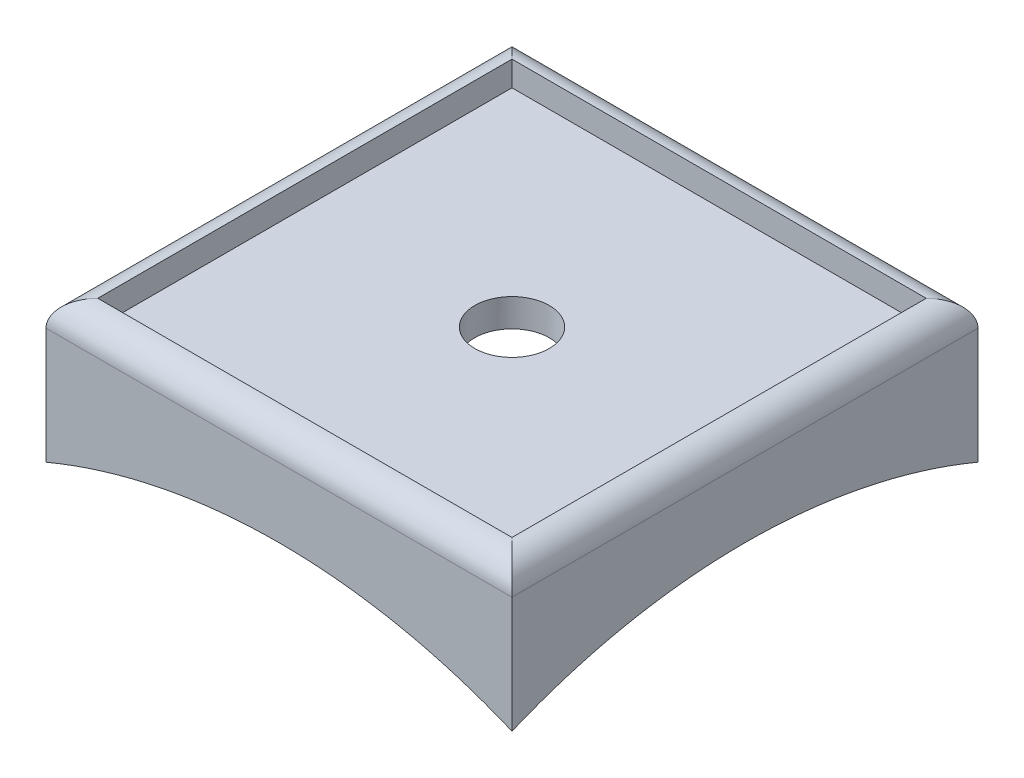
ISO-10303-21;
HEADER;
FILE_DESCRIPTION(('STEP AP214'),'2;1');
FILE_NAME('part.step','',(''),(''),'','','');
FILE_SCHEMA(('AUTOMOTIVE_DESIGN { 1 0 10303 214 1 1 1 1 }'));
ENDSEC;
DATA;
#1=APPLICATION_CONTEXT('core data for automotive mechanical design processes');
#2=APPLICATION_PROTOCOL_DEFINITION('international standard','automotive_design',2000,#1);
#3=PRODUCT_CONTEXT('',#1,'mechanical');
#4=PRODUCT('Part','Part','',(#3));
#5=PRODUCT_RELATED_PRODUCT_CATEGORY('part','',(#4));
#6=PRODUCT_DEFINITION_FORMATION('','',#4);
#7=PRODUCT_DEFINITION_CONTEXT('part definition',#1,'design');
#8=PRODUCT_DEFINITION('design','',#6,#7);
#9=PRODUCT_DEFINITION_SHAPE('','',#8);
#10=(LENGTH_UNIT() NAMED_UNIT(*) SI_UNIT(.MILLI.,.METRE.));
#11=(NAMED_UNIT(*) PLANE_ANGLE_UNIT() SI_UNIT($,.RADIAN.));
#12=(NAMED_UNIT(*) SI_UNIT($,.STERADIAN.) SOLID_ANGLE_UNIT());
#13=UNCERTAINTY_MEASURE_WITH_UNIT(LENGTH_MEASURE(1.E-05),#10,'distance_accuracy_value','');
#14=(GEOMETRIC_REPRESENTATION_CONTEXT(3) GLOBAL_UNCERTAINTY_ASSIGNED_CONTEXT((#13)) GLOBAL_UNIT_ASSIGNED_CONTEXT((#10,
#11,#12)) REPRESENTATION_CONTEXT('',''));
#15=CARTESIAN_POINT('',(0.,0.,0.));
#16=DIRECTION('',(0.,0.,1.));
#17=DIRECTION('',(1.,0.,0.));
#18=AXIS2_PLACEMENT_3D('',#15,#16,#17);
#19=CARTESIAN_POINT('',(18.75,-56.25,-18.75));
#20=DIRECTION('',(1.,0.,0.));
#21=DIRECTION('',(0.,0.,-1.));
#22=AXIS2_PLACEMENT_3D('',#19,#20,#21);
#23=PLANE('',#22);
#24=DIRECTION('',(0.,1.,0.));
#25=VECTOR('',#24,1.);
#26=CARTESIAN_POINT('',(18.75,-56.25,-18.75));
#27=LINE('',#26,#25);
#28=CARTESIAN_POINT('',(18.75,44.8279891486459,-18.75));
#29=VERTEX_POINT('',#28);
#30=CARTESIAN_POINT('',(18.75,54.1666666666667,-18.75));
#31=VERTEX_POINT('',#30);
#32=EDGE_CURVE('E147',#29,#31,#27,.T.);
#33=ORIENTED_EDGE('',*,*,#32,.T.);
#34=DIRECTION('',(0.,0.,-1.));
#35=VECTOR('',#34,1.);
#36=CARTESIAN_POINT('',(18.75,54.1666666666667,18.75));
#37=LINE('',#36,#35);
#38=CARTESIAN_POINT('',(18.75,54.1666666666667,18.75));
#39=VERTEX_POINT('',#38);
#40=EDGE_CURVE('E43',#31,#39,#37,.F.);
#41=ORIENTED_EDGE('',*,*,#40,.T.);
#42=DIRECTION('',(0.,1.,0.));
#43=VECTOR('',#42,1.);
#44=CARTESIAN_POINT('',(18.75,-56.25,18.75));
#45=LINE('',#44,#43);
#46=CARTESIAN_POINT('',(18.75,44.8279891486459,18.75));
#47=VERTEX_POINT('',#46);
#48=EDGE_CURVE('E148',#47,#39,#45,.T.);
#49=ORIENTED_EDGE('',*,*,#48,.F.);
#50=CARTESIAN_POINT('',(18.75,0.,0.));
#51=DIRECTION('',(1.,0.,0.));
#52=DIRECTION('',(0.,0.,-1.));
#53=AXIS2_PLACEMENT_3D('',#50,#51,#52);
#54=CIRCLE('',#53,48.5912657903775);
#55=EDGE_CURVE('E145',#29,#47,#54,.T.);
#56=ORIENTED_EDGE('',*,*,#55,.F.);
#57=EDGE_LOOP('',(#33,#41,#49,#56));
#58=FACE_BOUND('',#57,.T.);
#59=ADVANCED_FACE('F34',(#58),#23,.T.);
#60=CARTESIAN_POINT('',(-18.75,-56.25,18.75));
#61=DIRECTION('',(0.,0.,1.));
#62=DIRECTION('',(1.,0.,0.));
#63=AXIS2_PLACEMENT_3D('',#60,#61,#62);
#64=PLANE('',#63);
#65=ORIENTED_EDGE('',*,*,#48,.T.);
#66=DIRECTION('',(1.,0.,0.));
#67=VECTOR('',#66,1.);
#68=CARTESIAN_POINT('',(-18.75,54.1666666666667,18.75));
#69=LINE('',#68,#67);
#70=CARTESIAN_POINT('',(-18.75,54.1666666666667,18.75));
#71=VERTEX_POINT('',#70);
#72=EDGE_CURVE('E11',#39,#71,#69,.F.);
#73=ORIENTED_EDGE('',*,*,#72,.T.);
#74=DIRECTION('',(0.,1.,0.));
#75=VECTOR('',#74,1.);
#76=CARTESIAN_POINT('',(-18.75,-56.25,18.75));
#77=LINE('',#76,#75);
#78=CARTESIAN_POINT('',(-18.75,44.8279891486459,18.75));
#79=VERTEX_POINT('',#78);
#80=EDGE_CURVE('E151',#79,#71,#77,.T.);
#81=ORIENTED_EDGE('',*,*,#80,.F.);
#82=CARTESIAN_POINT('',(0.,0.,18.75));
#83=DIRECTION('',(0.,0.,1.));
#84=DIRECTION('',(1.,0.,0.));
#85=AXIS2_PLACEMENT_3D('',#82,#83,#84);
#86=CIRCLE('',#85,48.5912657903775);
#87=EDGE_CURVE('E143',#47,#79,#86,.T.);
#88=ORIENTED_EDGE('',*,*,#87,.F.);
#89=EDGE_LOOP('',(#65,#73,#81,#88));
#90=FACE_BOUND('',#89,.T.);
#91=ADVANCED_FACE('F191',(#90),#64,.T.);
#92=CARTESIAN_POINT('',(-18.75,-56.25,-18.75));
#93=DIRECTION('',(-1.,0.,0.));
#94=DIRECTION('',(0.,0.,1.));
#95=AXIS2_PLACEMENT_3D('',#92,#93,#94);
#96=PLANE('',#95);
#97=ORIENTED_EDGE('',*,*,#80,.T.);
#98=DIRECTION('',(0.,0.,1.));
#99=VECTOR('',#98,1.);
#100=CARTESIAN_POINT('',(-18.75,54.1666666666667,-18.75));
#101=LINE('',#100,#99);
#102=CARTESIAN_POINT('',(-18.75,54.1666666666667,-18.75));
#103=VERTEX_POINT('',#102);
#104=EDGE_CURVE('E167',#71,#103,#101,.F.);
#105=ORIENTED_EDGE('',*,*,#104,.T.);
#106=DIRECTION('',(0.,1.,0.));
#107=VECTOR('',#106,1.);
#108=CARTESIAN_POINT('',(-18.75,-56.25,-18.75));
#109=LINE('',#108,#107);
#110=CARTESIAN_POINT('',(-18.75,44.8279891486459,-18.75));
#111=VERTEX_POINT('',#110);
#112=EDGE_CURVE('E154',#111,#103,#109,.T.);
#113=ORIENTED_EDGE('',*,*,#112,.F.);
#114=CARTESIAN_POINT('',(-18.75,0.,0.));
#115=DIRECTION('',(-1.,0.,0.));
#116=DIRECTION('',(0.,0.,1.));
#117=AXIS2_PLACEMENT_3D('',#114,#115,#116);
#118=CIRCLE('',#117,48.5912657903775);
#119=EDGE_CURVE('E141',#79,#111,#118,.T.);
#120=ORIENTED_EDGE('',*,*,#119,.F.);
#121=EDGE_LOOP('',(#97,#105,#113,#120));
#122=FACE_BOUND('',#121,.T.);
#123=ADVANCED_FACE('F196',(#122),#96,.T.);
#124=CARTESIAN_POINT('',(-18.75,-56.25,-18.75));
#125=DIRECTION('',(0.,0.,-1.));
#126=DIRECTION('',(-1.,0.,0.));
#127=AXIS2_PLACEMENT_3D('',#124,#125,#126);
#128=PLANE('',#127);
#129=ORIENTED_EDGE('',*,*,#112,.T.);
#130=DIRECTION('',(-1.,0.,0.));
#131=VECTOR('',#130,1.);
#132=CARTESIAN_POINT('',(18.75,54.1666666666667,-18.75));
#133=LINE('',#132,#131);
#134=EDGE_CURVE('E58',#103,#31,#133,.F.);
#135=ORIENTED_EDGE('',*,*,#134,.T.);
#136=ORIENTED_EDGE('',*,*,#32,.F.);
#137=CARTESIAN_POINT('',(0.,0.,-18.75));
#138=DIRECTION('',(0.,0.,-1.));
#139=DIRECTION('',(-1.,0.,0.));
#140=AXIS2_PLACEMENT_3D('',#137,#138,#139);
#141=CIRCLE('',#140,48.5912657903775);
#142=EDGE_CURVE('E150',#111,#29,#141,.T.);
#143=ORIENTED_EDGE('',*,*,#142,.F.);
#144=EDGE_LOOP('',(#129,#135,#136,#143));
#145=FACE_BOUND('',#144,.T.);
#146=ADVANCED_FACE('F222',(#145),#128,.T.);
#147=CARTESIAN_POINT('',(0.,0.,0.));
#148=DIRECTION('',(0.,1.,0.));
#149=DIRECTION('',(1.,0.,0.));
#150=AXIS2_PLACEMENT_3D('',#147,#148,#149);
#151=SPHERICAL_SURFACE('',#150,52.0833333333333);
#152=CARTESIAN_POINT('',(0.,51.9968615505889,0.));
#153=DIRECTION('',(0.,-1.,0.));
#154=DIRECTION('',(0.,0.,-1.));
#155=AXIS2_PLACEMENT_3D('',#152,#153,#154);
#156=CIRCLE('',#155,3.);
#157=CARTESIAN_POINT('',(0.,51.9968615505889,-3.));
#158=VERTEX_POINT('',#157);
#159=EDGE_CURVE('E126',#158,#158,#156,.F.);
#160=ORIENTED_EDGE('',*,*,#159,.T.);
#161=EDGE_LOOP('',(#160));
#162=FACE_BOUND('',#161,.T.);
#163=ORIENTED_EDGE('',*,*,#55,.T.);
#164=ORIENTED_EDGE('',*,*,#87,.T.);
#165=ORIENTED_EDGE('',*,*,#119,.T.);
#166=ORIENTED_EDGE('',*,*,#142,.T.);
#167=EDGE_LOOP('',(#163,#164,#165,#166));
#168=FACE_BOUND('',#167,.T.);
#169=ADVANCED_FACE('F231',(#162,#168),#151,.F.);
#170=CARTESIAN_POINT('',(16.6666666666667,54.1666666666667,56.25));
#171=DIRECTION('',(0.,0.,1.));
#172=DIRECTION('',(1.,0.,0.));
#173=AXIS2_PLACEMENT_3D('',#170,#171,#172);
#174=CYLINDRICAL_SURFACE('',#173,2.08333333333333);
#175=CARTESIAN_POINT('',(16.6666666666667,54.1666666666667,16.6666666666667));
#176=DIRECTION('',(-0.707106781186547,0.,0.707106781186548));
#177=DIRECTION('',(-0.707106781186548,0.,-0.707106781186547));
#178=AXIS2_PLACEMENT_3D('',#175,#176,#177);
#179=ELLIPSE('',#178,2.94627825494395,2.08333333333333);
#180=CARTESIAN_POINT('',(16.6666666666667,56.25,16.6666666666667));
#181=VERTEX_POINT('',#180);
#182=EDGE_CURVE('E175',#39,#181,#179,.T.);
#183=ORIENTED_EDGE('',*,*,#182,.F.);
#184=ORIENTED_EDGE('',*,*,#40,.F.);
#185=CARTESIAN_POINT('',(16.6666666666667,54.1666666666667,-16.6666666666667));
#186=DIRECTION('',(0.707106781186548,0.,0.707106781186547));
#187=DIRECTION('',(-0.707106781186547,0.,0.707106781186548));
#188=AXIS2_PLACEMENT_3D('',#185,#186,#187);
#189=ELLIPSE('',#188,2.94627825494395,2.08333333333333);
#190=CARTESIAN_POINT('',(16.6666666666667,56.25,-16.6666666666667));
#191=VERTEX_POINT('',#190);
#192=EDGE_CURVE('E38',#191,#31,#189,.F.);
#193=ORIENTED_EDGE('',*,*,#192,.F.);
#194=DIRECTION('',(0.,0.,-1.));
#195=VECTOR('',#194,1.);
#196=CARTESIAN_POINT('',(16.6666666666667,56.25,-18.75));
#197=LINE('',#196,#195);
#198=EDGE_CURVE('E109',#181,#191,#197,.T.);
#199=ORIENTED_EDGE('',*,*,#198,.F.);
#200=EDGE_LOOP('',(#183,#184,#193,#199));
#201=FACE_BOUND('',#200,.T.);
#202=ADVANCED_FACE('F36',(#201),#174,.T.);
#203=CARTESIAN_POINT('',(-56.25,54.1666666666667,-16.6666666666667));
#204=DIRECTION('',(1.,0.,0.));
#205=DIRECTION('',(0.,0.,-1.));
#206=AXIS2_PLACEMENT_3D('',#203,#204,#205);
#207=CYLINDRICAL_SURFACE('',#206,2.08333333333333);
#208=ORIENTED_EDGE('',*,*,#192,.T.);
#209=ORIENTED_EDGE('',*,*,#134,.F.);
#210=CARTESIAN_POINT('',(-16.6666666666667,54.1666666666667,-16.6666666666667));
#211=DIRECTION('',(0.707106781186547,0.,-0.707106781186548));
#212=DIRECTION('',(0.707106781186547,0.,0.707106781186547));
#213=AXIS2_PLACEMENT_3D('',#210,#211,#212);
#214=ELLIPSE('',#213,2.94627825494395,2.08333333333333);
#215=CARTESIAN_POINT('',(-16.6666666666667,56.25,-16.6666666666667));
#216=VERTEX_POINT('',#215);
#217=EDGE_CURVE('E174',#216,#103,#214,.F.);
#218=ORIENTED_EDGE('',*,*,#217,.F.);
#219=DIRECTION('',(-1.,0.,0.));
#220=VECTOR('',#219,1.);
#221=CARTESIAN_POINT('',(-18.75,56.25,-16.6666666666667));
#222=LINE('',#221,#220);
#223=EDGE_CURVE('E162',#191,#216,#222,.T.);
#224=ORIENTED_EDGE('',*,*,#223,.F.);
#225=EDGE_LOOP('',(#208,#209,#218,#224));
#226=FACE_BOUND('',#225,.T.);
#227=ADVANCED_FACE('F184',(#226),#207,.T.);
#228=CARTESIAN_POINT('',(-56.25,54.1666666666667,16.6666666666667));
#229=DIRECTION('',(-1.,0.,0.));
#230=DIRECTION('',(0.,0.,1.));
#231=AXIS2_PLACEMENT_3D('',#228,#229,#230);
#232=CYLINDRICAL_SURFACE('',#231,2.08333333333333);
#233=ORIENTED_EDGE('',*,*,#182,.T.);
#234=DIRECTION('',(1.,0.,0.));
#235=VECTOR('',#234,1.);
#236=CARTESIAN_POINT('',(18.75,56.25,16.6666666666667));
#237=LINE('',#236,#235);
#238=CARTESIAN_POINT('',(-16.6666666666667,56.25,16.6666666666667));
#239=VERTEX_POINT('',#238);
#240=EDGE_CURVE('E158',#239,#181,#237,.T.);
#241=ORIENTED_EDGE('',*,*,#240,.F.);
#242=CARTESIAN_POINT('',(-16.6666666666667,54.1666666666667,16.6666666666667));
#243=DIRECTION('',(-0.707106781186547,0.,-0.707106781186547));
#244=DIRECTION('',(-0.707106781186547,0.,0.707106781186548));
#245=AXIS2_PLACEMENT_3D('',#242,#243,#244);
#246=ELLIPSE('',#245,2.94627825494395,2.08333333333333);
#247=EDGE_CURVE('E137',#71,#239,#246,.T.);
#248=ORIENTED_EDGE('',*,*,#247,.F.);
#249=ORIENTED_EDGE('',*,*,#72,.F.);
#250=EDGE_LOOP('',(#233,#241,#248,#249));
#251=FACE_BOUND('',#250,.T.);
#252=ADVANCED_FACE('F188',(#251),#232,.T.);
#253=CARTESIAN_POINT('',(-16.6666666666667,54.1666666666667,56.25));
#254=DIRECTION('',(0.,0.,-1.));
#255=DIRECTION('',(-1.,0.,0.));
#256=AXIS2_PLACEMENT_3D('',#253,#254,#255);
#257=CYLINDRICAL_SURFACE('',#256,2.08333333333333);
#258=ORIENTED_EDGE('',*,*,#217,.T.);
#259=ORIENTED_EDGE('',*,*,#104,.F.);
#260=ORIENTED_EDGE('',*,*,#247,.T.);
#261=DIRECTION('',(0.,0.,1.));
#262=VECTOR('',#261,1.);
#263=CARTESIAN_POINT('',(-16.6666666666667,56.25,18.75));
#264=LINE('',#263,#262);
#265=EDGE_CURVE('E164',#216,#239,#264,.T.);
#266=ORIENTED_EDGE('',*,*,#265,.F.);
#267=EDGE_LOOP('',(#258,#259,#260,#266));
#268=FACE_BOUND('',#267,.T.);
#269=ADVANCED_FACE('F199',(#268),#257,.T.);
#270=CARTESIAN_POINT('',(16.6666666666667,54.25,-16.6666666666667));
#271=DIRECTION('',(1.,0.,0.));
#272=DIRECTION('',(0.,0.,-1.));
#273=AXIS2_PLACEMENT_3D('',#270,#271,#272);
#274=PLANE('',#273);
#275=ORIENTED_EDGE('',*,*,#198,.T.);
#276=DIRECTION('',(0.,1.,0.));
#277=VECTOR('',#276,1.);
#278=CARTESIAN_POINT('',(16.6666666666667,54.25,-16.6666666666667));
#279=LINE('',#278,#277);
#280=CARTESIAN_POINT('',(16.6666666666667,54.25,-16.6666666666667));
#281=VERTEX_POINT('',#280);
#282=EDGE_CURVE('E102',#281,#191,#279,.T.);
#283=ORIENTED_EDGE('',*,*,#282,.F.);
#284=DIRECTION('',(0.,0.,-1.));
#285=VECTOR('',#284,1.);
#286=CARTESIAN_POINT('',(16.6666666666667,54.25,-16.6666666666667));
#287=LINE('',#286,#285);
#288=CARTESIAN_POINT('',(16.6666666666667,54.25,16.6666666666667));
#289=VERTEX_POINT('',#288);
#290=EDGE_CURVE('E106',#289,#281,#287,.T.);
#291=ORIENTED_EDGE('',*,*,#290,.F.);
#292=DIRECTION('',(0.,1.,0.));
#293=VECTOR('',#292,1.);
#294=CARTESIAN_POINT('',(16.6666666666667,54.25,16.6666666666667));
#295=LINE('',#294,#293);
#296=EDGE_CURVE('E135',#289,#181,#295,.T.);
#297=ORIENTED_EDGE('',*,*,#296,.T.);
#298=EDGE_LOOP('',(#275,#283,#291,#297));
#299=FACE_BOUND('',#298,.T.);
#300=ADVANCED_FACE('F104',(#299),#274,.F.);
#301=CARTESIAN_POINT('',(-16.6666666666667,54.25,16.6666666666667));
#302=DIRECTION('',(0.,0.,1.));
#303=DIRECTION('',(1.,0.,0.));
#304=AXIS2_PLACEMENT_3D('',#301,#302,#303);
#305=PLANE('',#304);
#306=ORIENTED_EDGE('',*,*,#240,.T.);
#307=ORIENTED_EDGE('',*,*,#296,.F.);
#308=DIRECTION('',(1.,0.,0.));
#309=VECTOR('',#308,1.);
#310=CARTESIAN_POINT('',(-16.6666666666667,54.25,16.6666666666667));
#311=LINE('',#310,#309);
#312=CARTESIAN_POINT('',(-16.6666666666667,54.25,16.6666666666667));
#313=VERTEX_POINT('',#312);
#314=EDGE_CURVE('E113',#313,#289,#311,.T.);
#315=ORIENTED_EDGE('',*,*,#314,.F.);
#316=DIRECTION('',(0.,1.,0.));
#317=VECTOR('',#316,1.);
#318=CARTESIAN_POINT('',(-16.6666666666667,54.25,16.6666666666667));
#319=LINE('',#318,#317);
#320=EDGE_CURVE('E138',#313,#239,#319,.T.);
#321=ORIENTED_EDGE('',*,*,#320,.T.);
#322=EDGE_LOOP('',(#306,#307,#315,#321));
#323=FACE_BOUND('',#322,.T.);
#324=ADVANCED_FACE('F204',(#323),#305,.F.);
#325=CARTESIAN_POINT('',(-16.6666666666667,54.25,-16.6666666666667));
#326=DIRECTION('',(-1.,0.,0.));
#327=DIRECTION('',(0.,0.,1.));
#328=AXIS2_PLACEMENT_3D('',#325,#326,#327);
#329=PLANE('',#328);
#330=ORIENTED_EDGE('',*,*,#265,.T.);
#331=ORIENTED_EDGE('',*,*,#320,.F.);
#332=DIRECTION('',(0.,0.,1.));
#333=VECTOR('',#332,1.);
#334=CARTESIAN_POINT('',(-16.6666666666667,54.25,-16.6666666666667));
#335=LINE('',#334,#333);
#336=CARTESIAN_POINT('',(-16.6666666666667,54.25,-16.6666666666667));
#337=VERTEX_POINT('',#336);
#338=EDGE_CURVE('E122',#337,#313,#335,.T.);
#339=ORIENTED_EDGE('',*,*,#338,.F.);
#340=DIRECTION('',(0.,1.,0.));
#341=VECTOR('',#340,1.);
#342=CARTESIAN_POINT('',(-16.6666666666667,54.25,-16.6666666666667));
#343=LINE('',#342,#341);
#344=EDGE_CURVE('E112',#337,#216,#343,.T.);
#345=ORIENTED_EDGE('',*,*,#344,.T.);
#346=EDGE_LOOP('',(#330,#331,#339,#345));
#347=FACE_BOUND('',#346,.T.);
#348=ADVANCED_FACE('F202',(#347),#329,.F.);
#349=CARTESIAN_POINT('',(-16.6666666666667,54.25,-16.6666666666667));
#350=DIRECTION('',(0.,0.,-1.));
#351=DIRECTION('',(-1.,0.,0.));
#352=AXIS2_PLACEMENT_3D('',#349,#350,#351);
#353=PLANE('',#352);
#354=ORIENTED_EDGE('',*,*,#223,.T.);
#355=ORIENTED_EDGE('',*,*,#344,.F.);
#356=DIRECTION('',(-1.,0.,0.));
#357=VECTOR('',#356,1.);
#358=CARTESIAN_POINT('',(-16.6666666666667,54.25,-16.6666666666667));
#359=LINE('',#358,#357);
#360=EDGE_CURVE('E116',#281,#337,#359,.T.);
#361=ORIENTED_EDGE('',*,*,#360,.F.);
#362=ORIENTED_EDGE('',*,*,#282,.T.);
#363=EDGE_LOOP('',(#354,#355,#361,#362));
#364=FACE_BOUND('',#363,.T.);
#365=ADVANCED_FACE('F117',(#364),#353,.F.);
#366=CARTESIAN_POINT('',(0.,54.25,0.));
#367=DIRECTION('',(0.,1.,0.));
#368=DIRECTION('',(0.,0.,1.));
#369=AXIS2_PLACEMENT_3D('',#366,#367,#368);
#370=PLANE('',#369);
#371=CARTESIAN_POINT('',(0.,54.25,0.));
#372=DIRECTION('',(0.,1.,0.));
#373=DIRECTION('',(0.,0.,1.));
#374=AXIS2_PLACEMENT_3D('',#371,#372,#373);
#375=CIRCLE('',#374,3.);
#376=CARTESIAN_POINT('',(0.,54.25,3.));
#377=VERTEX_POINT('',#376);
#378=EDGE_CURVE('E129',#377,#377,#375,.T.);
#379=ORIENTED_EDGE('',*,*,#378,.F.);
#380=EDGE_LOOP('',(#379));
#381=FACE_BOUND('',#380,.T.);
#382=ORIENTED_EDGE('',*,*,#290,.T.);
#383=ORIENTED_EDGE('',*,*,#360,.T.);
#384=ORIENTED_EDGE('',*,*,#338,.T.);
#385=ORIENTED_EDGE('',*,*,#314,.T.);
#386=EDGE_LOOP('',(#382,#383,#384,#385));
#387=FACE_BOUND('',#386,.T.);
#388=ADVANCED_FACE('F124',(#381,#387),#370,.T.);
#389=CARTESIAN_POINT('',(0.,48.25,0.));
#390=DIRECTION('',(0.,1.,0.));
#391=DIRECTION('',(0.,0.,1.));
#392=AXIS2_PLACEMENT_3D('',#389,#390,#391);
#393=CYLINDRICAL_SURFACE('',#392,3.);
#394=ORIENTED_EDGE('',*,*,#378,.T.);
#395=EDGE_LOOP('',(#394));
#396=FACE_BOUND('',#395,.T.);
#397=ORIENTED_EDGE('',*,*,#159,.F.);
#398=EDGE_LOOP('',(#397));
#399=FACE_BOUND('',#398,.T.);
#400=ADVANCED_FACE('F307',(#396,#399),#393,.F.);
#401=CLOSED_SHELL('',(#59,#91,#123,#146,#169,#202,#227,#252,#269,#300,#324,#348,#365,#388,#400));
#402=MANIFOLD_SOLID_BREP('B2',#401);
#403=ADVANCED_BREP_SHAPE_REPRESENTATION('',(#18,#402),#14);
#404=SHAPE_DEFINITION_REPRESENTATION(#9,#403);
ENDSEC;
END-ISO-10303-21;
